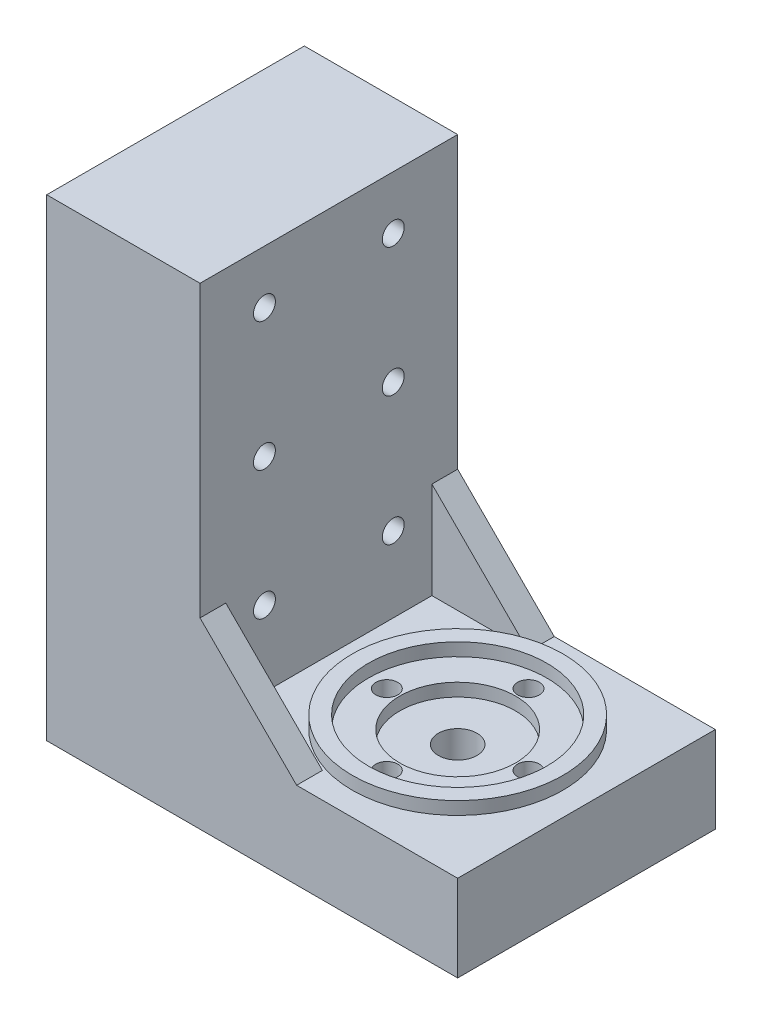
ISO-10303-21;
HEADER;
FILE_DESCRIPTION(('STEP AP214'),'2;1');
FILE_NAME('part.step','',(''),(''),'','','');
FILE_SCHEMA(('AUTOMOTIVE_DESIGN { 1 0 10303 214 1 1 1 1 }'));
ENDSEC;
DATA;
#1=APPLICATION_CONTEXT('core data for automotive mechanical design processes');
#2=APPLICATION_PROTOCOL_DEFINITION('international standard','automotive_design',2000,#1);
#3=PRODUCT_CONTEXT('',#1,'mechanical');
#4=PRODUCT('Part','Part','',(#3));
#5=PRODUCT_RELATED_PRODUCT_CATEGORY('part','',(#4));
#6=PRODUCT_DEFINITION_FORMATION('','',#4);
#7=PRODUCT_DEFINITION_CONTEXT('part definition',#1,'design');
#8=PRODUCT_DEFINITION('design','',#6,#7);
#9=PRODUCT_DEFINITION_SHAPE('','',#8);
#10=(LENGTH_UNIT() NAMED_UNIT(*) SI_UNIT(.MILLI.,.METRE.));
#11=(NAMED_UNIT(*) PLANE_ANGLE_UNIT() SI_UNIT($,.RADIAN.));
#12=(NAMED_UNIT(*) SI_UNIT($,.STERADIAN.) SOLID_ANGLE_UNIT());
#13=UNCERTAINTY_MEASURE_WITH_UNIT(LENGTH_MEASURE(1.E-05),#10,'distance_accuracy_value','');
#14=(GEOMETRIC_REPRESENTATION_CONTEXT(3) GLOBAL_UNCERTAINTY_ASSIGNED_CONTEXT((#13)) GLOBAL_UNIT_ASSIGNED_CONTEXT((#10,
#11,#12)) REPRESENTATION_CONTEXT('',''));
#15=CARTESIAN_POINT('',(0.,0.,0.));
#16=DIRECTION('',(0.,0.,1.));
#17=DIRECTION('',(1.,0.,0.));
#18=AXIS2_PLACEMENT_3D('',#15,#16,#17);
#19=CARTESIAN_POINT('',(20.,0.,-20.));
#20=DIRECTION('',(0.,1.,0.));
#21=DIRECTION('',(0.,0.,1.));
#22=AXIS2_PLACEMENT_3D('',#19,#20,#21);
#23=CYLINDRICAL_SURFACE('',#22,3.);
#24=CARTESIAN_POINT('',(20.,0.,-20.));
#25=DIRECTION('',(0.,1.,0.));
#26=DIRECTION('',(0.,0.,1.));
#27=AXIS2_PLACEMENT_3D('',#24,#25,#26);
#28=CIRCLE('',#27,3.);
#29=CARTESIAN_POINT('',(20.,0.,-17.));
#30=VERTEX_POINT('',#29);
#31=EDGE_CURVE('E120',#30,#30,#28,.T.);
#32=ORIENTED_EDGE('',*,*,#31,.F.);
#33=EDGE_LOOP('',(#32));
#34=FACE_BOUND('',#33,.T.);
#35=CARTESIAN_POINT('',(20.,11.4135450421839,-20.));
#36=DIRECTION('',(0.,1.,0.));
#37=DIRECTION('',(0.,0.,1.));
#38=AXIS2_PLACEMENT_3D('',#35,#36,#37);
#39=CIRCLE('',#38,3.);
#40=CARTESIAN_POINT('',(20.,11.4135450421839,-17.));
#41=VERTEX_POINT('',#40);
#42=EDGE_CURVE('E53',#41,#41,#39,.F.);
#43=ORIENTED_EDGE('',*,*,#42,.F.);
#44=EDGE_LOOP('',(#43));
#45=FACE_BOUND('',#44,.T.);
#46=ADVANCED_FACE('F49',(#34,#45),#23,.F.);
#47=CARTESIAN_POINT('',(0.,13.4135450421839,0.));
#48=DIRECTION('',(0.,-1.,0.));
#49=DIRECTION('',(0.,0.,-1.));
#50=AXIS2_PLACEMENT_3D('',#47,#48,#49);
#51=PLANE('',#50);
#52=CARTESIAN_POINT('',(20.,13.4135450421839,-20.));
#53=DIRECTION('',(0.,1.,0.));
#54=DIRECTION('',(0.,0.,1.));
#55=AXIS2_PLACEMENT_3D('',#52,#53,#54);
#56=CIRCLE('',#55,9.);
#57=CARTESIAN_POINT('',(20.,13.4135450421839,-11.));
#58=VERTEX_POINT('',#57);
#59=EDGE_CURVE('E250',#58,#58,#56,.T.);
#60=ORIENTED_EDGE('',*,*,#59,.F.);
#61=EDGE_LOOP('',(#60));
#62=FACE_BOUND('',#61,.T.);
#63=CARTESIAN_POINT('',(9.00000000000001,13.4135450421839,-20.));
#64=DIRECTION('',(0.,1.,0.));
#65=DIRECTION('',(0.,0.,1.));
#66=AXIS2_PLACEMENT_3D('',#63,#64,#65);
#67=CIRCLE('',#66,1.7);
#68=CARTESIAN_POINT('',(9.00000000000001,13.4135450421839,-18.3));
#69=VERTEX_POINT('',#68);
#70=EDGE_CURVE('E189',#69,#69,#67,.T.);
#71=ORIENTED_EDGE('',*,*,#70,.F.);
#72=EDGE_LOOP('',(#71));
#73=FACE_BOUND('',#72,.T.);
#74=CARTESIAN_POINT('',(20.,13.4135450421839,-9.));
#75=DIRECTION('',(0.,1.,0.));
#76=DIRECTION('',(0.,0.,1.));
#77=AXIS2_PLACEMENT_3D('',#74,#75,#76);
#78=CIRCLE('',#77,1.7);
#79=CARTESIAN_POINT('',(20.,13.4135450421839,-7.3));
#80=VERTEX_POINT('',#79);
#81=EDGE_CURVE('E196',#80,#80,#78,.T.);
#82=ORIENTED_EDGE('',*,*,#81,.F.);
#83=EDGE_LOOP('',(#82));
#84=FACE_BOUND('',#83,.T.);
#85=CARTESIAN_POINT('',(20.,13.4135450421839,-31.));
#86=DIRECTION('',(0.,1.,0.));
#87=DIRECTION('',(0.,0.,1.));
#88=AXIS2_PLACEMENT_3D('',#85,#86,#87);
#89=CIRCLE('',#88,1.7);
#90=CARTESIAN_POINT('',(20.,13.4135450421839,-29.3));
#91=VERTEX_POINT('',#90);
#92=EDGE_CURVE('E202',#91,#91,#89,.T.);
#93=ORIENTED_EDGE('',*,*,#92,.F.);
#94=EDGE_LOOP('',(#93));
#95=FACE_BOUND('',#94,.T.);
#96=CARTESIAN_POINT('',(31.,13.4135450421839,-20.));
#97=DIRECTION('',(0.,1.,0.));
#98=DIRECTION('',(0.,0.,1.));
#99=AXIS2_PLACEMENT_3D('',#96,#97,#98);
#100=CIRCLE('',#99,1.7);
#101=CARTESIAN_POINT('',(31.,13.4135450421839,-18.3));
#102=VERTEX_POINT('',#101);
#103=EDGE_CURVE('E205',#102,#102,#100,.T.);
#104=ORIENTED_EDGE('',*,*,#103,.F.);
#105=EDGE_LOOP('',(#104));
#106=FACE_BOUND('',#105,.T.);
#107=CARTESIAN_POINT('',(20.,13.4135450421839,-20.));
#108=DIRECTION('',(0.,1.,0.));
#109=DIRECTION('',(0.,0.,1.));
#110=AXIS2_PLACEMENT_3D('',#107,#108,#109);
#111=CIRCLE('',#110,13.85);
#112=CARTESIAN_POINT('',(20.,13.4135450421839,-6.15));
#113=VERTEX_POINT('',#112);
#114=EDGE_CURVE('E213',#113,#113,#111,.T.);
#115=ORIENTED_EDGE('',*,*,#114,.T.);
#116=EDGE_LOOP('',(#115));
#117=FACE_BOUND('',#116,.T.);
#118=ADVANCED_FACE('F263',(#62,#73,#84,#95,#106,#117),#51,.F.);
#119=CARTESIAN_POINT('',(0.,13.4135450421839,0.));
#120=DIRECTION('',(0.,0.,-1.));
#121=DIRECTION('',(-1.,0.,0.));
#122=AXIS2_PLACEMENT_3D('',#119,#120,#121);
#123=PLANE('',#122);
#124=DIRECTION('',(1.,0.,0.));
#125=VECTOR('',#124,1.);
#126=CARTESIAN_POINT('',(0.,13.4135450421839,0.));
#127=LINE('',#126,#125);
#128=CARTESIAN_POINT('',(15.,13.4135450421839,0.));
#129=VERTEX_POINT('',#128);
#130=CARTESIAN_POINT('',(40.,13.4135450421839,0.));
#131=VERTEX_POINT('',#130);
#132=EDGE_CURVE('E115',#129,#131,#127,.T.);
#133=ORIENTED_EDGE('',*,*,#132,.F.);
#134=DIRECTION('',(-0.707106781186548,0.707106781186547,0.));
#135=VECTOR('',#134,1.);
#136=CARTESIAN_POINT('',(0.,28.4135450421839,0.));
#137=LINE('',#136,#135);
#138=CARTESIAN_POINT('',(0.,28.4135450421839,0.));
#139=VERTEX_POINT('',#138);
#140=EDGE_CURVE('E65',#129,#139,#137,.T.);
#141=ORIENTED_EDGE('',*,*,#140,.T.);
#142=DIRECTION('',(0.,1.,0.));
#143=VECTOR('',#142,1.);
#144=CARTESIAN_POINT('',(0.,0.,0.));
#145=LINE('',#144,#143);
#146=CARTESIAN_POINT('',(0.,73.4135450421839,0.));
#147=VERTEX_POINT('',#146);
#148=EDGE_CURVE('E137',#139,#147,#145,.T.);
#149=ORIENTED_EDGE('',*,*,#148,.T.);
#150=DIRECTION('',(1.,0.,0.));
#151=VECTOR('',#150,1.);
#152=CARTESIAN_POINT('',(-23.8042415574383,73.4135450421839,0.));
#153=LINE('',#152,#151);
#154=CARTESIAN_POINT('',(-23.8042415574383,73.4135450421839,0.));
#155=VERTEX_POINT('',#154);
#156=EDGE_CURVE('E126',#155,#147,#153,.T.);
#157=ORIENTED_EDGE('',*,*,#156,.F.);
#158=DIRECTION('',(0.,1.,0.));
#159=VECTOR('',#158,1.);
#160=CARTESIAN_POINT('',(-23.8042415574383,0.,0.));
#161=LINE('',#160,#159);
#162=CARTESIAN_POINT('',(-23.8042415574383,0.,0.));
#163=VERTEX_POINT('',#162);
#164=EDGE_CURVE('E145',#163,#155,#161,.T.);
#165=ORIENTED_EDGE('',*,*,#164,.F.);
#166=DIRECTION('',(1.,0.,0.));
#167=VECTOR('',#166,1.);
#168=CARTESIAN_POINT('',(0.,0.,0.));
#169=LINE('',#168,#167);
#170=CARTESIAN_POINT('',(40.,0.,0.));
#171=VERTEX_POINT('',#170);
#172=EDGE_CURVE('E97',#163,#171,#169,.T.);
#173=ORIENTED_EDGE('',*,*,#172,.T.);
#174=DIRECTION('',(0.,-1.,0.));
#175=VECTOR('',#174,1.);
#176=CARTESIAN_POINT('',(40.,13.4135450421839,0.));
#177=LINE('',#176,#175);
#178=EDGE_CURVE('E58',#131,#171,#177,.T.);
#179=ORIENTED_EDGE('',*,*,#178,.F.);
#180=EDGE_LOOP('',(#133,#141,#149,#157,#165,#173,#179));
#181=FACE_BOUND('',#180,.T.);
#182=ADVANCED_FACE('F51',(#181),#123,.F.);
#183=CARTESIAN_POINT('',(40.,13.4135450421839,0.));
#184=DIRECTION('',(-1.,0.,0.));
#185=DIRECTION('',(0.,0.,1.));
#186=AXIS2_PLACEMENT_3D('',#183,#184,#185);
#187=PLANE('',#186);
#188=DIRECTION('',(0.,0.,-1.));
#189=VECTOR('',#188,1.);
#190=CARTESIAN_POINT('',(40.,0.,0.));
#191=LINE('',#190,#189);
#192=CARTESIAN_POINT('',(40.,0.,-40.));
#193=VERTEX_POINT('',#192);
#194=EDGE_CURVE('E87',#171,#193,#191,.T.);
#195=ORIENTED_EDGE('',*,*,#194,.T.);
#196=DIRECTION('',(0.,-1.,0.));
#197=VECTOR('',#196,1.);
#198=CARTESIAN_POINT('',(40.,13.4135450421839,-40.));
#199=LINE('',#198,#197);
#200=CARTESIAN_POINT('',(40.,13.4135450421839,-40.));
#201=VERTEX_POINT('',#200);
#202=EDGE_CURVE('E90',#201,#193,#199,.T.);
#203=ORIENTED_EDGE('',*,*,#202,.F.);
#204=DIRECTION('',(0.,0.,-1.));
#205=VECTOR('',#204,1.);
#206=CARTESIAN_POINT('',(40.,13.4135450421839,0.));
#207=LINE('',#206,#205);
#208=EDGE_CURVE('E74',#131,#201,#207,.T.);
#209=ORIENTED_EDGE('',*,*,#208,.F.);
#210=ORIENTED_EDGE('',*,*,#178,.T.);
#211=EDGE_LOOP('',(#195,#203,#209,#210));
#212=FACE_BOUND('',#211,.T.);
#213=ADVANCED_FACE('F89',(#212),#187,.F.);
#214=CARTESIAN_POINT('',(0.,13.4135450421839,-40.));
#215=DIRECTION('',(0.,0.,1.));
#216=DIRECTION('',(1.,0.,0.));
#217=AXIS2_PLACEMENT_3D('',#214,#215,#216);
#218=PLANE('',#217);
#219=DIRECTION('',(-1.,0.,0.));
#220=VECTOR('',#219,1.);
#221=CARTESIAN_POINT('',(0.,0.,-40.));
#222=LINE('',#221,#220);
#223=CARTESIAN_POINT('',(-23.8042415574383,0.,-40.));
#224=VERTEX_POINT('',#223);
#225=EDGE_CURVE('E96',#193,#224,#222,.T.);
#226=ORIENTED_EDGE('',*,*,#225,.T.);
#227=DIRECTION('',(0.,-1.,0.));
#228=VECTOR('',#227,1.);
#229=CARTESIAN_POINT('',(-23.8042415574383,0.,-40.));
#230=LINE('',#229,#228);
#231=CARTESIAN_POINT('',(-23.8042415574383,73.4135450421839,-40.));
#232=VERTEX_POINT('',#231);
#233=EDGE_CURVE('E136',#232,#224,#230,.T.);
#234=ORIENTED_EDGE('',*,*,#233,.F.);
#235=DIRECTION('',(1.,0.,0.));
#236=VECTOR('',#235,1.);
#237=CARTESIAN_POINT('',(-23.8042415574383,73.4135450421839,-40.));
#238=LINE('',#237,#236);
#239=CARTESIAN_POINT('',(0.,73.4135450421839,-40.));
#240=VERTEX_POINT('',#239);
#241=EDGE_CURVE('E129',#232,#240,#238,.T.);
#242=ORIENTED_EDGE('',*,*,#241,.T.);
#243=DIRECTION('',(0.,-1.,0.));
#244=VECTOR('',#243,1.);
#245=CARTESIAN_POINT('',(0.,0.,-40.));
#246=LINE('',#245,#244);
#247=CARTESIAN_POINT('',(0.,28.4135450421839,-40.));
#248=VERTEX_POINT('',#247);
#249=EDGE_CURVE('E139',#240,#248,#246,.T.);
#250=ORIENTED_EDGE('',*,*,#249,.T.);
#251=DIRECTION('',(0.707106781186548,-0.707106781186547,0.));
#252=VECTOR('',#251,1.);
#253=CARTESIAN_POINT('',(15.,13.4135450421839,-40.));
#254=LINE('',#253,#252);
#255=CARTESIAN_POINT('',(15.,13.4135450421839,-40.));
#256=VERTEX_POINT('',#255);
#257=EDGE_CURVE('E225',#248,#256,#254,.T.);
#258=ORIENTED_EDGE('',*,*,#257,.T.);
#259=DIRECTION('',(-1.,0.,0.));
#260=VECTOR('',#259,1.);
#261=CARTESIAN_POINT('',(0.,13.4135450421839,-40.));
#262=LINE('',#261,#260);
#263=EDGE_CURVE('E106',#201,#256,#262,.T.);
#264=ORIENTED_EDGE('',*,*,#263,.F.);
#265=ORIENTED_EDGE('',*,*,#202,.T.);
#266=EDGE_LOOP('',(#226,#234,#242,#250,#258,#264,#265));
#267=FACE_BOUND('',#266,.T.);
#268=ADVANCED_FACE('F101',(#267),#218,.F.);
#269=CARTESIAN_POINT('',(20.,13.4135450421839,-20.));
#270=DIRECTION('',(0.,-1.,0.));
#271=DIRECTION('',(0.,0.,-1.));
#272=AXIS2_PLACEMENT_3D('',#269,#270,#271);
#273=CIRCLE('',#272,16.35);
#274=CARTESIAN_POINT('',(20.,13.4135450421839,-36.35));
#275=VERTEX_POINT('',#274);
#276=EDGE_CURVE('E12',#275,#275,#273,.F.);
#277=ORIENTED_EDGE('',*,*,#276,.F.);
#278=EDGE_LOOP('',(#277));
#279=FACE_BOUND('',#278,.T.);
#280=DIRECTION('',(1.,0.,0.));
#281=VECTOR('',#280,1.);
#282=CARTESIAN_POINT('',(15.,13.4135450421839,-4.));
#283=LINE('',#282,#281);
#284=CARTESIAN_POINT('',(0.,13.4135450421839,-4.));
#285=VERTEX_POINT('',#284);
#286=CARTESIAN_POINT('',(15.,13.4135450421839,-4.));
#287=VERTEX_POINT('',#286);
#288=EDGE_CURVE('E238',#285,#287,#283,.T.);
#289=ORIENTED_EDGE('',*,*,#288,.T.);
#290=DIRECTION('',(0.,0.,1.));
#291=VECTOR('',#290,1.);
#292=CARTESIAN_POINT('',(15.,13.4135450421839,-4.));
#293=LINE('',#292,#291);
#294=EDGE_CURVE('E228',#287,#129,#293,.T.);
#295=ORIENTED_EDGE('',*,*,#294,.T.);
#296=ORIENTED_EDGE('',*,*,#132,.T.);
#297=ORIENTED_EDGE('',*,*,#208,.T.);
#298=ORIENTED_EDGE('',*,*,#263,.T.);
#299=DIRECTION('',(0.,0.,-1.));
#300=VECTOR('',#299,1.);
#301=CARTESIAN_POINT('',(15.,13.4135450421839,-36.));
#302=LINE('',#301,#300);
#303=CARTESIAN_POINT('',(15.,13.4135450421839,-36.));
#304=VERTEX_POINT('',#303);
#305=EDGE_CURVE('E216',#304,#256,#302,.T.);
#306=ORIENTED_EDGE('',*,*,#305,.F.);
#307=DIRECTION('',(-1.,0.,0.));
#308=VECTOR('',#307,1.);
#309=CARTESIAN_POINT('',(0.,13.4135450421839,-36.));
#310=LINE('',#309,#308);
#311=CARTESIAN_POINT('',(0.,13.4135450421839,-36.));
#312=VERTEX_POINT('',#311);
#313=EDGE_CURVE('E227',#304,#312,#310,.T.);
#314=ORIENTED_EDGE('',*,*,#313,.T.);
#315=DIRECTION('',(0.,0.,1.));
#316=VECTOR('',#315,1.);
#317=CARTESIAN_POINT('',(0.,13.4135450421839,0.));
#318=LINE('',#317,#316);
#319=EDGE_CURVE('E112',#312,#285,#318,.T.);
#320=ORIENTED_EDGE('',*,*,#319,.T.);
#321=EDGE_LOOP('',(#289,#295,#296,#297,#298,#306,#314,#320));
#322=FACE_BOUND('',#321,.T.);
#323=ADVANCED_FACE('F272',(#279,#322),#51,.F.);
#324=CARTESIAN_POINT('',(0.,0.,0.));
#325=DIRECTION('',(0.,-1.,0.));
#326=DIRECTION('',(0.,0.,-1.));
#327=AXIS2_PLACEMENT_3D('',#324,#325,#326);
#328=PLANE('',#327);
#329=CARTESIAN_POINT('',(31.,0.,-20.));
#330=DIRECTION('',(0.,1.,0.));
#331=DIRECTION('',(0.,0.,1.));
#332=AXIS2_PLACEMENT_3D('',#329,#330,#331);
#333=CIRCLE('',#332,1.7);
#334=CARTESIAN_POINT('',(31.,0.,-18.3));
#335=VERTEX_POINT('',#334);
#336=EDGE_CURVE('E183',#335,#335,#333,.T.);
#337=ORIENTED_EDGE('',*,*,#336,.T.);
#338=EDGE_LOOP('',(#337));
#339=FACE_BOUND('',#338,.T.);
#340=CARTESIAN_POINT('',(20.,0.,-31.));
#341=DIRECTION('',(0.,1.,0.));
#342=DIRECTION('',(0.,0.,1.));
#343=AXIS2_PLACEMENT_3D('',#340,#341,#342);
#344=CIRCLE('',#343,1.7);
#345=CARTESIAN_POINT('',(20.,0.,-29.3));
#346=VERTEX_POINT('',#345);
#347=EDGE_CURVE('E199',#346,#346,#344,.T.);
#348=ORIENTED_EDGE('',*,*,#347,.T.);
#349=EDGE_LOOP('',(#348));
#350=FACE_BOUND('',#349,.T.);
#351=CARTESIAN_POINT('',(20.,0.,-9.));
#352=DIRECTION('',(0.,1.,0.));
#353=DIRECTION('',(0.,0.,1.));
#354=AXIS2_PLACEMENT_3D('',#351,#352,#353);
#355=CIRCLE('',#354,1.7);
#356=CARTESIAN_POINT('',(20.,0.,-7.3));
#357=VERTEX_POINT('',#356);
#358=EDGE_CURVE('E193',#357,#357,#355,.T.);
#359=ORIENTED_EDGE('',*,*,#358,.T.);
#360=EDGE_LOOP('',(#359));
#361=FACE_BOUND('',#360,.T.);
#362=CARTESIAN_POINT('',(9.00000000000001,0.,-20.));
#363=DIRECTION('',(0.,1.,0.));
#364=DIRECTION('',(0.,0.,1.));
#365=AXIS2_PLACEMENT_3D('',#362,#363,#364);
#366=CIRCLE('',#365,1.7);
#367=CARTESIAN_POINT('',(9.00000000000001,0.,-18.3));
#368=VERTEX_POINT('',#367);
#369=EDGE_CURVE('E186',#368,#368,#366,.T.);
#370=ORIENTED_EDGE('',*,*,#369,.T.);
#371=EDGE_LOOP('',(#370));
#372=FACE_BOUND('',#371,.T.);
#373=ORIENTED_EDGE('',*,*,#31,.T.);
#374=EDGE_LOOP('',(#373));
#375=FACE_BOUND('',#374,.T.);
#376=ORIENTED_EDGE('',*,*,#172,.F.);
#377=DIRECTION('',(0.,0.,1.));
#378=VECTOR('',#377,1.);
#379=CARTESIAN_POINT('',(-23.8042415574383,0.,-40.));
#380=LINE('',#379,#378);
#381=EDGE_CURVE('E110',#224,#163,#380,.T.);
#382=ORIENTED_EDGE('',*,*,#381,.F.);
#383=ORIENTED_EDGE('',*,*,#225,.F.);
#384=ORIENTED_EDGE('',*,*,#194,.F.);
#385=EDGE_LOOP('',(#376,#382,#383,#384));
#386=FACE_BOUND('',#385,.T.);
#387=ADVANCED_FACE('F108',(#339,#350,#361,#372,#375,#386),#328,.T.);
#388=CARTESIAN_POINT('',(0.,0.,0.));
#389=DIRECTION('',(1.,0.,0.));
#390=DIRECTION('',(0.,0.,-1.));
#391=AXIS2_PLACEMENT_3D('',#388,#389,#390);
#392=PLANE('',#391);
#393=DIRECTION('',(0.,0.,1.));
#394=VECTOR('',#393,1.);
#395=CARTESIAN_POINT('',(0.,28.4135450421839,-4.));
#396=LINE('',#395,#394);
#397=CARTESIAN_POINT('',(0.,28.4135450421839,-4.));
#398=VERTEX_POINT('',#397);
#399=EDGE_CURVE('E236',#398,#139,#396,.T.);
#400=ORIENTED_EDGE('',*,*,#399,.F.);
#401=DIRECTION('',(0.,-1.,0.));
#402=VECTOR('',#401,1.);
#403=CARTESIAN_POINT('',(0.,28.4135450421839,-4.));
#404=LINE('',#403,#402);
#405=EDGE_CURVE('E245',#398,#285,#404,.T.);
#406=ORIENTED_EDGE('',*,*,#405,.T.);
#407=ORIENTED_EDGE('',*,*,#319,.F.);
#408=DIRECTION('',(0.,1.,0.));
#409=VECTOR('',#408,1.);
#410=CARTESIAN_POINT('',(0.,28.4135450421839,-36.));
#411=LINE('',#410,#409);
#412=CARTESIAN_POINT('',(0.,28.4135450421839,-36.));
#413=VERTEX_POINT('',#412);
#414=EDGE_CURVE('E231',#312,#413,#411,.T.);
#415=ORIENTED_EDGE('',*,*,#414,.T.);
#416=DIRECTION('',(0.,0.,-1.));
#417=VECTOR('',#416,1.);
#418=CARTESIAN_POINT('',(0.,28.4135450421839,-36.));
#419=LINE('',#418,#417);
#420=EDGE_CURVE('E219',#413,#248,#419,.T.);
#421=ORIENTED_EDGE('',*,*,#420,.T.);
#422=ORIENTED_EDGE('',*,*,#249,.F.);
#423=DIRECTION('',(0.,0.,-1.));
#424=VECTOR('',#423,1.);
#425=CARTESIAN_POINT('',(0.,73.4135450421839,-40.));
#426=LINE('',#425,#424);
#427=EDGE_CURVE('E133',#147,#240,#426,.T.);
#428=ORIENTED_EDGE('',*,*,#427,.F.);
#429=ORIENTED_EDGE('',*,*,#148,.F.);
#430=EDGE_LOOP('',(#400,#406,#407,#415,#421,#422,#428,#429));
#431=FACE_BOUND('',#430,.T.);
#432=CARTESIAN_POINT('',(0.,25.1312601410274,-10.));
#433=DIRECTION('',(1.,0.,0.));
#434=DIRECTION('',(0.,0.,-1.));
#435=AXIS2_PLACEMENT_3D('',#432,#433,#434);
#436=CIRCLE('',#435,1.7);
#437=CARTESIAN_POINT('',(0.,25.1312601410274,-11.7));
#438=VERTEX_POINT('',#437);
#439=EDGE_CURVE('E171',#438,#438,#436,.T.);
#440=ORIENTED_EDGE('',*,*,#439,.F.);
#441=EDGE_LOOP('',(#440));
#442=FACE_BOUND('',#441,.T.);
#443=CARTESIAN_POINT('',(0.,45.1312601410274,-30.));
#444=DIRECTION('',(1.,0.,0.));
#445=DIRECTION('',(0.,0.,-1.));
#446=AXIS2_PLACEMENT_3D('',#443,#444,#445);
#447=CIRCLE('',#446,1.7);
#448=CARTESIAN_POINT('',(0.,45.1312601410274,-31.7));
#449=VERTEX_POINT('',#448);
#450=EDGE_CURVE('E160',#449,#449,#447,.T.);
#451=ORIENTED_EDGE('',*,*,#450,.F.);
#452=EDGE_LOOP('',(#451));
#453=FACE_BOUND('',#452,.T.);
#454=CARTESIAN_POINT('',(0.,45.1312601410274,-10.));
#455=DIRECTION('',(1.,0.,0.));
#456=DIRECTION('',(0.,0.,-1.));
#457=AXIS2_PLACEMENT_3D('',#454,#455,#456);
#458=CIRCLE('',#457,1.7);
#459=CARTESIAN_POINT('',(0.,45.1312601410274,-11.7));
#460=VERTEX_POINT('',#459);
#461=EDGE_CURVE('E159',#460,#460,#458,.T.);
#462=ORIENTED_EDGE('',*,*,#461,.F.);
#463=EDGE_LOOP('',(#462));
#464=FACE_BOUND('',#463,.T.);
#465=CARTESIAN_POINT('',(0.,65.1312601410274,-30.));
#466=DIRECTION('',(1.,0.,0.));
#467=DIRECTION('',(0.,0.,-1.));
#468=AXIS2_PLACEMENT_3D('',#465,#466,#467);
#469=CIRCLE('',#468,1.7);
#470=CARTESIAN_POINT('',(0.,65.1312601410274,-31.7));
#471=VERTEX_POINT('',#470);
#472=EDGE_CURVE('E153',#471,#471,#469,.T.);
#473=ORIENTED_EDGE('',*,*,#472,.F.);
#474=EDGE_LOOP('',(#473));
#475=FACE_BOUND('',#474,.T.);
#476=CARTESIAN_POINT('',(0.,25.1312601410274,-30.));
#477=DIRECTION('',(1.,0.,0.));
#478=DIRECTION('',(0.,0.,-1.));
#479=AXIS2_PLACEMENT_3D('',#476,#477,#478);
#480=CIRCLE('',#479,1.7);
#481=CARTESIAN_POINT('',(0.,25.1312601410274,-31.7));
#482=VERTEX_POINT('',#481);
#483=EDGE_CURVE('E172',#482,#482,#480,.T.);
#484=ORIENTED_EDGE('',*,*,#483,.F.);
#485=EDGE_LOOP('',(#484));
#486=FACE_BOUND('',#485,.T.);
#487=CARTESIAN_POINT('',(0.,65.1312601410274,-10.));
#488=DIRECTION('',(1.,0.,0.));
#489=DIRECTION('',(0.,0.,-1.));
#490=AXIS2_PLACEMENT_3D('',#487,#488,#489);
#491=CIRCLE('',#490,1.7);
#492=CARTESIAN_POINT('',(0.,65.1312601410274,-11.7));
#493=VERTEX_POINT('',#492);
#494=EDGE_CURVE('E150',#493,#493,#491,.T.);
#495=ORIENTED_EDGE('',*,*,#494,.F.);
#496=EDGE_LOOP('',(#495));
#497=FACE_BOUND('',#496,.T.);
#498=ADVANCED_FACE('F282',(#431,#442,#453,#464,#475,#486,#497),#392,.T.);
#499=CARTESIAN_POINT('',(-23.8042415574383,73.4135450421839,-40.));
#500=DIRECTION('',(0.,-1.,0.));
#501=DIRECTION('',(0.,0.,-1.));
#502=AXIS2_PLACEMENT_3D('',#499,#500,#501);
#503=PLANE('',#502);
#504=ORIENTED_EDGE('',*,*,#427,.T.);
#505=ORIENTED_EDGE('',*,*,#241,.F.);
#506=DIRECTION('',(0.,0.,-1.));
#507=VECTOR('',#506,1.);
#508=CARTESIAN_POINT('',(-23.8042415574383,73.4135450421839,-40.));
#509=LINE('',#508,#507);
#510=EDGE_CURVE('E132',#155,#232,#509,.T.);
#511=ORIENTED_EDGE('',*,*,#510,.F.);
#512=ORIENTED_EDGE('',*,*,#156,.T.);
#513=EDGE_LOOP('',(#504,#505,#511,#512));
#514=FACE_BOUND('',#513,.T.);
#515=ADVANCED_FACE('F275',(#514),#503,.F.);
#516=CARTESIAN_POINT('',(-23.8042415574383,0.,0.));
#517=DIRECTION('',(1.,0.,0.));
#518=DIRECTION('',(0.,0.,-1.));
#519=AXIS2_PLACEMENT_3D('',#516,#517,#518);
#520=PLANE('',#519);
#521=CARTESIAN_POINT('',(-23.8042415574383,25.1312601410274,-10.));
#522=DIRECTION('',(1.,0.,0.));
#523=DIRECTION('',(0.,0.,-1.));
#524=AXIS2_PLACEMENT_3D('',#521,#522,#523);
#525=CIRCLE('',#524,1.7);
#526=CARTESIAN_POINT('',(-23.8042415574383,25.1312601410274,-11.7));
#527=VERTEX_POINT('',#526);
#528=EDGE_CURVE('E168',#527,#527,#525,.T.);
#529=ORIENTED_EDGE('',*,*,#528,.T.);
#530=EDGE_LOOP('',(#529));
#531=FACE_BOUND('',#530,.T.);
#532=CARTESIAN_POINT('',(-23.8042415574383,45.1312601410274,-30.));
#533=DIRECTION('',(1.,0.,0.));
#534=DIRECTION('',(0.,0.,-1.));
#535=AXIS2_PLACEMENT_3D('',#532,#533,#534);
#536=CIRCLE('',#535,1.7);
#537=CARTESIAN_POINT('',(-23.8042415574383,45.1312601410274,-31.7));
#538=VERTEX_POINT('',#537);
#539=EDGE_CURVE('E175',#538,#538,#536,.T.);
#540=ORIENTED_EDGE('',*,*,#539,.T.);
#541=EDGE_LOOP('',(#540));
#542=FACE_BOUND('',#541,.T.);
#543=CARTESIAN_POINT('',(-23.8042415574383,45.1312601410274,-10.));
#544=DIRECTION('',(1.,0.,0.));
#545=DIRECTION('',(0.,0.,-1.));
#546=AXIS2_PLACEMENT_3D('',#543,#544,#545);
#547=CIRCLE('',#546,1.7);
#548=CARTESIAN_POINT('',(-23.8042415574383,45.1312601410274,-11.7));
#549=VERTEX_POINT('',#548);
#550=EDGE_CURVE('E156',#549,#549,#547,.T.);
#551=ORIENTED_EDGE('',*,*,#550,.T.);
#552=EDGE_LOOP('',(#551));
#553=FACE_BOUND('',#552,.T.);
#554=CARTESIAN_POINT('',(-23.8042415574383,65.1312601410274,-30.));
#555=DIRECTION('',(1.,0.,0.));
#556=DIRECTION('',(0.,0.,-1.));
#557=AXIS2_PLACEMENT_3D('',#554,#555,#556);
#558=CIRCLE('',#557,1.7);
#559=CARTESIAN_POINT('',(-23.8042415574383,65.1312601410274,-31.7));
#560=VERTEX_POINT('',#559);
#561=EDGE_CURVE('E163',#560,#560,#558,.T.);
#562=ORIENTED_EDGE('',*,*,#561,.T.);
#563=EDGE_LOOP('',(#562));
#564=FACE_BOUND('',#563,.T.);
#565=CARTESIAN_POINT('',(-23.8042415574383,25.1312601410274,-30.));
#566=DIRECTION('',(1.,0.,0.));
#567=DIRECTION('',(0.,0.,-1.));
#568=AXIS2_PLACEMENT_3D('',#565,#566,#567);
#569=CIRCLE('',#568,1.7);
#570=CARTESIAN_POINT('',(-23.8042415574383,25.1312601410274,-31.7));
#571=VERTEX_POINT('',#570);
#572=EDGE_CURVE('E180',#571,#571,#569,.T.);
#573=ORIENTED_EDGE('',*,*,#572,.T.);
#574=EDGE_LOOP('',(#573));
#575=FACE_BOUND('',#574,.T.);
#576=CARTESIAN_POINT('',(-23.8042415574383,65.1312601410274,-10.));
#577=DIRECTION('',(1.,0.,0.));
#578=DIRECTION('',(0.,0.,-1.));
#579=AXIS2_PLACEMENT_3D('',#576,#577,#578);
#580=CIRCLE('',#579,1.7);
#581=CARTESIAN_POINT('',(-23.8042415574383,65.1312601410274,-11.7));
#582=VERTEX_POINT('',#581);
#583=EDGE_CURVE('E142',#582,#582,#580,.T.);
#584=ORIENTED_EDGE('',*,*,#583,.T.);
#585=EDGE_LOOP('',(#584));
#586=FACE_BOUND('',#585,.T.);
#587=ORIENTED_EDGE('',*,*,#233,.T.);
#588=ORIENTED_EDGE('',*,*,#381,.T.);
#589=ORIENTED_EDGE('',*,*,#164,.T.);
#590=ORIENTED_EDGE('',*,*,#510,.T.);
#591=EDGE_LOOP('',(#587,#588,#589,#590));
#592=FACE_BOUND('',#591,.T.);
#593=ADVANCED_FACE('F349',(#531,#542,#553,#564,#575,#586,#592),#520,.F.);
#594=CARTESIAN_POINT('',(-23.8042415574383,65.1312601410274,-10.));
#595=DIRECTION('',(1.,0.,0.));
#596=DIRECTION('',(0.,0.,-1.));
#597=AXIS2_PLACEMENT_3D('',#594,#595,#596);
#598=CYLINDRICAL_SURFACE('',#597,1.7);
#599=ORIENTED_EDGE('',*,*,#583,.F.);
#600=EDGE_LOOP('',(#599));
#601=FACE_BOUND('',#600,.T.);
#602=ORIENTED_EDGE('',*,*,#494,.T.);
#603=EDGE_LOOP('',(#602));
#604=FACE_BOUND('',#603,.T.);
#605=ADVANCED_FACE('F353',(#601,#604),#598,.F.);
#606=CARTESIAN_POINT('',(-23.8042415574383,25.1312601410274,-30.));
#607=DIRECTION('',(1.,0.,0.));
#608=DIRECTION('',(0.,0.,-1.));
#609=AXIS2_PLACEMENT_3D('',#606,#607,#608);
#610=CYLINDRICAL_SURFACE('',#609,1.7);
#611=ORIENTED_EDGE('',*,*,#572,.F.);
#612=EDGE_LOOP('',(#611));
#613=FACE_BOUND('',#612,.T.);
#614=ORIENTED_EDGE('',*,*,#483,.T.);
#615=EDGE_LOOP('',(#614));
#616=FACE_BOUND('',#615,.T.);
#617=ADVANCED_FACE('F359',(#613,#616),#610,.F.);
#618=CARTESIAN_POINT('',(-23.8042415574383,65.1312601410274,-30.));
#619=DIRECTION('',(1.,0.,0.));
#620=DIRECTION('',(0.,0.,-1.));
#621=AXIS2_PLACEMENT_3D('',#618,#619,#620);
#622=CYLINDRICAL_SURFACE('',#621,1.7);
#623=ORIENTED_EDGE('',*,*,#561,.F.);
#624=EDGE_LOOP('',(#623));
#625=FACE_BOUND('',#624,.T.);
#626=ORIENTED_EDGE('',*,*,#472,.T.);
#627=EDGE_LOOP('',(#626));
#628=FACE_BOUND('',#627,.T.);
#629=ADVANCED_FACE('F446',(#625,#628),#622,.F.);
#630=CARTESIAN_POINT('',(-23.8042415574383,45.1312601410274,-10.));
#631=DIRECTION('',(1.,0.,0.));
#632=DIRECTION('',(0.,0.,-1.));
#633=AXIS2_PLACEMENT_3D('',#630,#631,#632);
#634=CYLINDRICAL_SURFACE('',#633,1.7);
#635=ORIENTED_EDGE('',*,*,#550,.F.);
#636=EDGE_LOOP('',(#635));
#637=FACE_BOUND('',#636,.T.);
#638=ORIENTED_EDGE('',*,*,#461,.T.);
#639=EDGE_LOOP('',(#638));
#640=FACE_BOUND('',#639,.T.);
#641=ADVANCED_FACE('F451',(#637,#640),#634,.F.);
#642=CARTESIAN_POINT('',(-23.8042415574383,45.1312601410274,-30.));
#643=DIRECTION('',(1.,0.,0.));
#644=DIRECTION('',(0.,0.,-1.));
#645=AXIS2_PLACEMENT_3D('',#642,#643,#644);
#646=CYLINDRICAL_SURFACE('',#645,1.7);
#647=ORIENTED_EDGE('',*,*,#539,.F.);
#648=EDGE_LOOP('',(#647));
#649=FACE_BOUND('',#648,.T.);
#650=ORIENTED_EDGE('',*,*,#450,.T.);
#651=EDGE_LOOP('',(#650));
#652=FACE_BOUND('',#651,.T.);
#653=ADVANCED_FACE('F448',(#649,#652),#646,.F.);
#654=CARTESIAN_POINT('',(-23.8042415574383,25.1312601410274,-10.));
#655=DIRECTION('',(1.,0.,0.));
#656=DIRECTION('',(0.,0.,-1.));
#657=AXIS2_PLACEMENT_3D('',#654,#655,#656);
#658=CYLINDRICAL_SURFACE('',#657,1.7);
#659=ORIENTED_EDGE('',*,*,#528,.F.);
#660=EDGE_LOOP('',(#659));
#661=FACE_BOUND('',#660,.T.);
#662=ORIENTED_EDGE('',*,*,#439,.T.);
#663=EDGE_LOOP('',(#662));
#664=FACE_BOUND('',#663,.T.);
#665=ADVANCED_FACE('F442',(#661,#664),#658,.F.);
#666=CARTESIAN_POINT('',(9.00000000000001,0.,-20.));
#667=DIRECTION('',(0.,1.,0.));
#668=DIRECTION('',(0.,0.,1.));
#669=AXIS2_PLACEMENT_3D('',#666,#667,#668);
#670=CYLINDRICAL_SURFACE('',#669,1.7);
#671=ORIENTED_EDGE('',*,*,#369,.F.);
#672=EDGE_LOOP('',(#671));
#673=FACE_BOUND('',#672,.T.);
#674=ORIENTED_EDGE('',*,*,#70,.T.);
#675=EDGE_LOOP('',(#674));
#676=FACE_BOUND('',#675,.T.);
#677=ADVANCED_FACE('F438',(#673,#676),#670,.F.);
#678=CARTESIAN_POINT('',(20.,0.,-9.));
#679=DIRECTION('',(0.,1.,0.));
#680=DIRECTION('',(0.,0.,1.));
#681=AXIS2_PLACEMENT_3D('',#678,#679,#680);
#682=CYLINDRICAL_SURFACE('',#681,1.7);
#683=ORIENTED_EDGE('',*,*,#358,.F.);
#684=EDGE_LOOP('',(#683));
#685=FACE_BOUND('',#684,.T.);
#686=ORIENTED_EDGE('',*,*,#81,.T.);
#687=EDGE_LOOP('',(#686));
#688=FACE_BOUND('',#687,.T.);
#689=ADVANCED_FACE('F434',(#685,#688),#682,.F.);
#690=CARTESIAN_POINT('',(20.,0.,-31.));
#691=DIRECTION('',(0.,1.,0.));
#692=DIRECTION('',(0.,0.,1.));
#693=AXIS2_PLACEMENT_3D('',#690,#691,#692);
#694=CYLINDRICAL_SURFACE('',#693,1.7);
#695=ORIENTED_EDGE('',*,*,#347,.F.);
#696=EDGE_LOOP('',(#695));
#697=FACE_BOUND('',#696,.T.);
#698=ORIENTED_EDGE('',*,*,#92,.T.);
#699=EDGE_LOOP('',(#698));
#700=FACE_BOUND('',#699,.T.);
#701=ADVANCED_FACE('F430',(#697,#700),#694,.F.);
#702=CARTESIAN_POINT('',(31.,0.,-20.));
#703=DIRECTION('',(0.,1.,0.));
#704=DIRECTION('',(0.,0.,1.));
#705=AXIS2_PLACEMENT_3D('',#702,#703,#704);
#706=CYLINDRICAL_SURFACE('',#705,1.7);
#707=ORIENTED_EDGE('',*,*,#336,.F.);
#708=EDGE_LOOP('',(#707));
#709=FACE_BOUND('',#708,.T.);
#710=ORIENTED_EDGE('',*,*,#103,.T.);
#711=EDGE_LOOP('',(#710));
#712=FACE_BOUND('',#711,.T.);
#713=ADVANCED_FACE('F423',(#709,#712),#706,.F.);
#714=CARTESIAN_POINT('',(20.,15.4135450421839,-20.));
#715=DIRECTION('',(0.,1.,0.));
#716=DIRECTION('',(0.,0.,1.));
#717=AXIS2_PLACEMENT_3D('',#714,#715,#716);
#718=PLANE('',#717);
#719=CARTESIAN_POINT('',(20.,15.4135450421839,-20.));
#720=DIRECTION('',(0.,1.,0.));
#721=DIRECTION('',(0.,0.,1.));
#722=AXIS2_PLACEMENT_3D('',#719,#720,#721);
#723=CIRCLE('',#722,16.35);
#724=CARTESIAN_POINT('',(20.,15.4135450421839,-3.64999999999999));
#725=VERTEX_POINT('',#724);
#726=EDGE_CURVE('E190',#725,#725,#723,.T.);
#727=ORIENTED_EDGE('',*,*,#726,.T.);
#728=EDGE_LOOP('',(#727));
#729=FACE_BOUND('',#728,.T.);
#730=CARTESIAN_POINT('',(20.,15.4135450421839,-20.));
#731=DIRECTION('',(0.,1.,0.));
#732=DIRECTION('',(0.,0.,1.));
#733=AXIS2_PLACEMENT_3D('',#730,#731,#732);
#734=CIRCLE('',#733,13.85);
#735=CARTESIAN_POINT('',(20.,15.4135450421839,-6.15));
#736=VERTEX_POINT('',#735);
#737=EDGE_CURVE('E212',#736,#736,#734,.T.);
#738=ORIENTED_EDGE('',*,*,#737,.F.);
#739=EDGE_LOOP('',(#738));
#740=FACE_BOUND('',#739,.T.);
#741=ADVANCED_FACE('F420',(#729,#740),#718,.T.);
#742=CARTESIAN_POINT('',(20.,15.4135450421839,-20.));
#743=DIRECTION('',(0.,-1.,0.));
#744=DIRECTION('',(0.,0.,-1.));
#745=AXIS2_PLACEMENT_3D('',#742,#743,#744);
#746=CYLINDRICAL_SURFACE('',#745,16.35);
#747=ORIENTED_EDGE('',*,*,#726,.F.);
#748=EDGE_LOOP('',(#747));
#749=FACE_BOUND('',#748,.T.);
#750=ORIENTED_EDGE('',*,*,#276,.T.);
#751=EDGE_LOOP('',(#750));
#752=FACE_BOUND('',#751,.T.);
#753=ADVANCED_FACE('F418',(#749,#752),#746,.T.);
#754=CARTESIAN_POINT('',(20.,15.4135450421839,-20.));
#755=DIRECTION('',(0.,-1.,0.));
#756=DIRECTION('',(0.,0.,-1.));
#757=AXIS2_PLACEMENT_3D('',#754,#755,#756);
#758=CYLINDRICAL_SURFACE('',#757,13.85);
#759=ORIENTED_EDGE('',*,*,#737,.T.);
#760=EDGE_LOOP('',(#759));
#761=FACE_BOUND('',#760,.T.);
#762=ORIENTED_EDGE('',*,*,#114,.F.);
#763=EDGE_LOOP('',(#762));
#764=FACE_BOUND('',#763,.T.);
#765=ADVANCED_FACE('F415',(#761,#764),#758,.F.);
#766=CARTESIAN_POINT('',(15.,13.4135450421839,-36.));
#767=DIRECTION('',(0.707106781186547,0.707106781186548,0.));
#768=DIRECTION('',(-0.707106781186548,0.707106781186547,0.));
#769=AXIS2_PLACEMENT_3D('',#766,#767,#768);
#770=PLANE('',#769);
#771=ORIENTED_EDGE('',*,*,#257,.F.);
#772=ORIENTED_EDGE('',*,*,#420,.F.);
#773=DIRECTION('',(0.707106781186548,-0.707106781186547,0.));
#774=VECTOR('',#773,1.);
#775=CARTESIAN_POINT('',(15.,13.4135450421839,-36.));
#776=LINE('',#775,#774);
#777=EDGE_CURVE('E222',#413,#304,#776,.T.);
#778=ORIENTED_EDGE('',*,*,#777,.T.);
#779=ORIENTED_EDGE('',*,*,#305,.T.);
#780=EDGE_LOOP('',(#771,#772,#778,#779));
#781=FACE_BOUND('',#780,.T.);
#782=ADVANCED_FACE('F331',(#781),#770,.T.);
#783=CARTESIAN_POINT('',(0.,0.,-36.));
#784=DIRECTION('',(0.,0.,-1.));
#785=DIRECTION('',(-1.,0.,0.));
#786=AXIS2_PLACEMENT_3D('',#783,#784,#785);
#787=PLANE('',#786);
#788=ORIENTED_EDGE('',*,*,#313,.F.);
#789=ORIENTED_EDGE('',*,*,#777,.F.);
#790=ORIENTED_EDGE('',*,*,#414,.F.);
#791=EDGE_LOOP('',(#788,#789,#790));
#792=FACE_BOUND('',#791,.T.);
#793=ADVANCED_FACE('F325',(#792),#787,.F.);
#794=CARTESIAN_POINT('',(0.,28.4135450421839,-4.));
#795=DIRECTION('',(0.707106781186547,0.707106781186548,0.));
#796=DIRECTION('',(-0.707106781186548,0.707106781186547,0.));
#797=AXIS2_PLACEMENT_3D('',#794,#795,#796);
#798=PLANE('',#797);
#799=ORIENTED_EDGE('',*,*,#140,.F.);
#800=ORIENTED_EDGE('',*,*,#294,.F.);
#801=DIRECTION('',(-0.707106781186548,0.707106781186547,0.));
#802=VECTOR('',#801,1.);
#803=CARTESIAN_POINT('',(0.,28.4135450421839,-4.));
#804=LINE('',#803,#802);
#805=EDGE_CURVE('E242',#287,#398,#804,.T.);
#806=ORIENTED_EDGE('',*,*,#805,.T.);
#807=ORIENTED_EDGE('',*,*,#399,.T.);
#808=EDGE_LOOP('',(#799,#800,#806,#807));
#809=FACE_BOUND('',#808,.T.);
#810=ADVANCED_FACE('F301',(#809),#798,.T.);
#811=CARTESIAN_POINT('',(0.,0.,-4.));
#812=DIRECTION('',(0.,0.,-1.));
#813=DIRECTION('',(-1.,0.,0.));
#814=AXIS2_PLACEMENT_3D('',#811,#812,#813);
#815=PLANE('',#814);
#816=ORIENTED_EDGE('',*,*,#805,.F.);
#817=ORIENTED_EDGE('',*,*,#288,.F.);
#818=ORIENTED_EDGE('',*,*,#405,.F.);
#819=EDGE_LOOP('',(#816,#817,#818));
#820=FACE_BOUND('',#819,.T.);
#821=ADVANCED_FACE('F308',(#820),#815,.T.);
#822=CARTESIAN_POINT('',(20.,11.4135450421839,-20.));
#823=DIRECTION('',(0.,1.,0.));
#824=DIRECTION('',(0.,0.,1.));
#825=AXIS2_PLACEMENT_3D('',#822,#823,#824);
#826=PLANE('',#825);
#827=CARTESIAN_POINT('',(20.,11.4135450421839,-20.));
#828=DIRECTION('',(0.,1.,0.));
#829=DIRECTION('',(0.,0.,1.));
#830=AXIS2_PLACEMENT_3D('',#827,#828,#829);
#831=CIRCLE('',#830,9.);
#832=CARTESIAN_POINT('',(20.,11.4135450421839,-11.));
#833=VERTEX_POINT('',#832);
#834=EDGE_CURVE('E253',#833,#833,#831,.T.);
#835=ORIENTED_EDGE('',*,*,#834,.T.);
#836=EDGE_LOOP('',(#835));
#837=FACE_BOUND('',#836,.T.);
#838=ORIENTED_EDGE('',*,*,#42,.T.);
#839=EDGE_LOOP('',(#838));
#840=FACE_BOUND('',#839,.T.);
#841=ADVANCED_FACE('F260',(#837,#840),#826,.T.);
#842=CARTESIAN_POINT('',(20.,11.4135450421839,-20.));
#843=DIRECTION('',(0.,1.,0.));
#844=DIRECTION('',(0.,0.,1.));
#845=AXIS2_PLACEMENT_3D('',#842,#843,#844);
#846=CYLINDRICAL_SURFACE('',#845,9.);
#847=ORIENTED_EDGE('',*,*,#834,.F.);
#848=EDGE_LOOP('',(#847));
#849=FACE_BOUND('',#848,.T.);
#850=ORIENTED_EDGE('',*,*,#59,.T.);
#851=EDGE_LOOP('',(#850));
#852=FACE_BOUND('',#851,.T.);
#853=ADVANCED_FACE('F398',(#849,#852),#846,.F.);
#854=CLOSED_SHELL('',(#46,#118,#182,#213,#268,#323,#387,#498,#515,#593,#605,#617,#629,#641,#653,
#665,#677,#689,#701,#713,#741,#753,#765,#782,#793,#810,#821,#841,#853));
#855=MANIFOLD_SOLID_BREP('B2',#854);
#856=ADVANCED_BREP_SHAPE_REPRESENTATION('',(#18,#855),#14);
#857=SHAPE_DEFINITION_REPRESENTATION(#9,#856);
ENDSEC;
END-ISO-10303-21;
